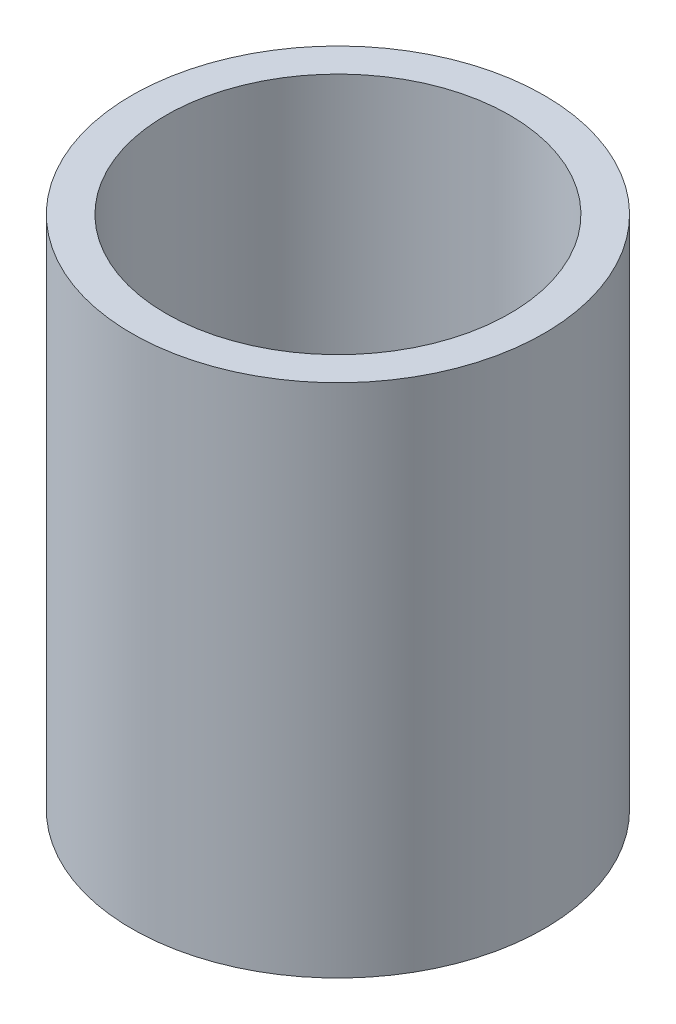
ISO-10303-21;
HEADER;
FILE_DESCRIPTION(('STEP AP214'),'2;1');
FILE_NAME('part.step','',(''),(''),'','','');
FILE_SCHEMA(('AUTOMOTIVE_DESIGN { 1 0 10303 214 1 1 1 1 }'));
ENDSEC;
DATA;
#1=APPLICATION_CONTEXT('core data for automotive mechanical design processes');
#2=APPLICATION_PROTOCOL_DEFINITION('international standard','automotive_design',2000,#1);
#3=PRODUCT_CONTEXT('',#1,'mechanical');
#4=PRODUCT('Part','Part','',(#3));
#5=PRODUCT_RELATED_PRODUCT_CATEGORY('part','',(#4));
#6=PRODUCT_DEFINITION_FORMATION('','',#4);
#7=PRODUCT_DEFINITION_CONTEXT('part definition',#1,'design');
#8=PRODUCT_DEFINITION('design','',#6,#7);
#9=PRODUCT_DEFINITION_SHAPE('','',#8);
#10=(LENGTH_UNIT() NAMED_UNIT(*) SI_UNIT(.MILLI.,.METRE.));
#11=(NAMED_UNIT(*) PLANE_ANGLE_UNIT() SI_UNIT($,.RADIAN.));
#12=(NAMED_UNIT(*) SI_UNIT($,.STERADIAN.) SOLID_ANGLE_UNIT());
#13=UNCERTAINTY_MEASURE_WITH_UNIT(LENGTH_MEASURE(1.E-05),#10,'distance_accuracy_value','');
#14=(GEOMETRIC_REPRESENTATION_CONTEXT(3) GLOBAL_UNCERTAINTY_ASSIGNED_CONTEXT((#13)) GLOBAL_UNIT_ASSIGNED_CONTEXT((#10,
#11,#12)) REPRESENTATION_CONTEXT('',''));
#15=CARTESIAN_POINT('',(0.,0.,0.));
#16=DIRECTION('',(0.,0.,1.));
#17=DIRECTION('',(1.,0.,0.));
#18=AXIS2_PLACEMENT_3D('',#15,#16,#17);
#19=CARTESIAN_POINT('',(0.,45.,-0.545038043279879));
#20=DIRECTION('',(0.,1.,0.));
#21=DIRECTION('',(0.,0.,1.));
#22=AXIS2_PLACEMENT_3D('',#19,#20,#21);
#23=PLANE('',#22);
#24=CARTESIAN_POINT('',(0.,45.,-0.545038043279879));
#25=DIRECTION('',(0.,1.,0.));
#26=DIRECTION('',(0.,0.,1.));
#27=AXIS2_PLACEMENT_3D('',#24,#25,#26);
#28=CIRCLE('',#27,18.);
#29=CARTESIAN_POINT('',(0.,45.,-18.5450380432799));
#30=VERTEX_POINT('',#29);
#31=EDGE_CURVE('E10',#30,#30,#28,.T.);
#32=ORIENTED_EDGE('',*,*,#31,.T.);
#33=EDGE_LOOP('',(#32));
#34=FACE_BOUND('',#33,.T.);
#35=CARTESIAN_POINT('',(0.,45.,-0.545038043279879));
#36=DIRECTION('',(0.,1.,0.));
#37=DIRECTION('',(0.,0.,1.));
#38=AXIS2_PLACEMENT_3D('',#35,#36,#37);
#39=CIRCLE('',#38,15.);
#40=CARTESIAN_POINT('',(0.,45.,-15.5450380432799));
#41=VERTEX_POINT('',#40);
#42=EDGE_CURVE('E52',#41,#41,#39,.T.);
#43=ORIENTED_EDGE('',*,*,#42,.F.);
#44=EDGE_LOOP('',(#43));
#45=FACE_BOUND('',#44,.T.);
#46=ADVANCED_FACE('F39',(#34,#45),#23,.T.);
#47=CARTESIAN_POINT('',(0.,0.,-0.545038043279879));
#48=DIRECTION('',(0.,1.,0.));
#49=DIRECTION('',(0.,0.,1.));
#50=AXIS2_PLACEMENT_3D('',#47,#48,#49);
#51=PLANE('',#50);
#52=CARTESIAN_POINT('',(0.,0.,-0.545038043279879));
#53=DIRECTION('',(0.,1.,0.));
#54=DIRECTION('',(0.,0.,1.));
#55=AXIS2_PLACEMENT_3D('',#52,#53,#54);
#56=CIRCLE('',#55,18.);
#57=CARTESIAN_POINT('',(0.,0.,-18.5450380432799));
#58=VERTEX_POINT('',#57);
#59=EDGE_CURVE('E43',#58,#58,#56,.T.);
#60=ORIENTED_EDGE('',*,*,#59,.F.);
#61=EDGE_LOOP('',(#60));
#62=FACE_BOUND('',#61,.T.);
#63=CARTESIAN_POINT('',(0.,0.,-0.545038043279879));
#64=DIRECTION('',(0.,1.,0.));
#65=DIRECTION('',(0.,0.,1.));
#66=AXIS2_PLACEMENT_3D('',#63,#64,#65);
#67=CIRCLE('',#66,15.);
#68=CARTESIAN_POINT('',(0.,0.,-15.5450380432799));
#69=VERTEX_POINT('',#68);
#70=EDGE_CURVE('E54',#69,#69,#67,.T.);
#71=ORIENTED_EDGE('',*,*,#70,.T.);
#72=EDGE_LOOP('',(#71));
#73=FACE_BOUND('',#72,.T.);
#74=ADVANCED_FACE('F66',(#62,#73),#51,.F.);
#75=CARTESIAN_POINT('',(0.,45.,-0.545038043279879));
#76=DIRECTION('',(0.,-1.,0.));
#77=DIRECTION('',(0.,0.,-1.));
#78=AXIS2_PLACEMENT_3D('',#75,#76,#77);
#79=CYLINDRICAL_SURFACE('',#78,18.);
#80=CARTESIAN_POINT('',(0.,45.,-18.5450380432799));
#81=CARTESIAN_POINT('',(0.,44.53125,-18.5450380432799));
#82=CARTESIAN_POINT('',(0.,44.0625,-18.5450380432799));
#83=CARTESIAN_POINT('',(0.,43.125,-18.5450380432799));
#84=CARTESIAN_POINT('',(0.,42.65625,-18.5450380432799));
#85=CARTESIAN_POINT('',(0.,41.71875,-18.5450380432799));
#86=CARTESIAN_POINT('',(0.,41.25,-18.5450380432799));
#87=CARTESIAN_POINT('',(0.,40.3125,-18.5450380432799));
#88=CARTESIAN_POINT('',(0.,39.84375,-18.5450380432799));
#89=CARTESIAN_POINT('',(0.,38.90625,-18.5450380432799));
#90=CARTESIAN_POINT('',(0.,38.4375,-18.5450380432799));
#91=CARTESIAN_POINT('',(0.,37.5,-18.5450380432799));
#92=CARTESIAN_POINT('',(0.,37.03125,-18.5450380432799));
#93=CARTESIAN_POINT('',(0.,36.09375,-18.5450380432799));
#94=CARTESIAN_POINT('',(0.,35.625,-18.5450380432799));
#95=CARTESIAN_POINT('',(0.,34.6875,-18.5450380432799));
#96=CARTESIAN_POINT('',(0.,34.21875,-18.5450380432799));
#97=CARTESIAN_POINT('',(0.,33.28125,-18.5450380432799));
#98=CARTESIAN_POINT('',(0.,32.8125,-18.5450380432799));
#99=CARTESIAN_POINT('',(0.,31.875,-18.5450380432799));
#100=CARTESIAN_POINT('',(0.,31.40625,-18.5450380432799));
#101=CARTESIAN_POINT('',(0.,30.46875,-18.5450380432799));
#102=CARTESIAN_POINT('',(0.,30.,-18.5450380432799));
#103=CARTESIAN_POINT('',(0.,29.0625,-18.5450380432799));
#104=CARTESIAN_POINT('',(0.,28.59375,-18.5450380432799));
#105=CARTESIAN_POINT('',(0.,27.65625,-18.5450380432799));
#106=CARTESIAN_POINT('',(0.,27.1875,-18.5450380432799));
#107=CARTESIAN_POINT('',(0.,26.25,-18.5450380432799));
#108=CARTESIAN_POINT('',(0.,25.78125,-18.5450380432799));
#109=CARTESIAN_POINT('',(0.,24.84375,-18.5450380432799));
#110=CARTESIAN_POINT('',(0.,24.375,-18.5450380432799));
#111=CARTESIAN_POINT('',(0.,23.4375,-18.5450380432799));
#112=CARTESIAN_POINT('',(0.,22.96875,-18.5450380432799));
#113=CARTESIAN_POINT('',(0.,22.03125,-18.5450380432799));
#114=CARTESIAN_POINT('',(0.,21.5625,-18.5450380432799));
#115=CARTESIAN_POINT('',(0.,20.625,-18.5450380432799));
#116=CARTESIAN_POINT('',(0.,20.15625,-18.5450380432799));
#117=CARTESIAN_POINT('',(0.,19.21875,-18.5450380432799));
#118=CARTESIAN_POINT('',(0.,18.75,-18.5450380432799));
#119=CARTESIAN_POINT('',(0.,17.8125,-18.5450380432799));
#120=CARTESIAN_POINT('',(0.,17.34375,-18.5450380432799));
#121=CARTESIAN_POINT('',(0.,16.40625,-18.5450380432799));
#122=CARTESIAN_POINT('',(0.,15.9375,-18.5450380432799));
#123=CARTESIAN_POINT('',(0.,15.,-18.5450380432799));
#124=CARTESIAN_POINT('',(0.,14.53125,-18.5450380432799));
#125=CARTESIAN_POINT('',(0.,13.59375,-18.5450380432799));
#126=CARTESIAN_POINT('',(0.,13.125,-18.5450380432799));
#127=CARTESIAN_POINT('',(0.,12.1875,-18.5450380432799));
#128=CARTESIAN_POINT('',(0.,11.71875,-18.5450380432799));
#129=CARTESIAN_POINT('',(0.,10.78125,-18.5450380432799));
#130=CARTESIAN_POINT('',(0.,10.3125,-18.5450380432799));
#131=CARTESIAN_POINT('',(0.,9.375,-18.5450380432799));
#132=CARTESIAN_POINT('',(0.,8.90625,-18.5450380432799));
#133=CARTESIAN_POINT('',(0.,7.96874999999999,-18.5450380432799));
#134=CARTESIAN_POINT('',(0.,7.5,-18.5450380432799));
#135=CARTESIAN_POINT('',(0.,6.5625,-18.5450380432799));
#136=CARTESIAN_POINT('',(0.,6.09375,-18.5450380432799));
#137=CARTESIAN_POINT('',(0.,5.15625,-18.5450380432799));
#138=CARTESIAN_POINT('',(0.,4.68749999999999,-18.5450380432799));
#139=CARTESIAN_POINT('',(0.,3.74999999999999,-18.5450380432799));
#140=CARTESIAN_POINT('',(0.,3.28124999999999,-18.5450380432799));
#141=CARTESIAN_POINT('',(0.,2.34374999999999,-18.5450380432799));
#142=CARTESIAN_POINT('',(0.,1.87499999999999,-18.5450380432799));
#143=CARTESIAN_POINT('',(0.,0.937499999999992,-18.5450380432799));
#144=CARTESIAN_POINT('',(0.,0.468749999999993,-18.5450380432799));
#145=CARTESIAN_POINT('',(0.,0.,-18.5450380432799));
#146=B_SPLINE_CURVE_WITH_KNOTS('',3,(#80,#81,#82,#83,#84,#85,#86,#87,#88,#89,#90,#91,#92,#93,
#94,#95,#96,#97,#98,#99,#100,#101,#102,#103,#104,#105,#106,#107,#108,#109,#110,#111,#112,#113,
#114,#115,#116,#117,#118,#119,#120,#121,#122,#123,#124,#125,#126,#127,#128,#129,#130,#131,#132,
#133,#134,#135,#136,#137,#138,#139,#140,#141,#142,#143,#144,#145),.UNSPECIFIED.,.F.,.F.,(4,2,2,
2,2,2,2,2,2,2,2,2,2,2,2,2,2,2,2,2,2,2,2,2,2,2,2,2,2,2,2,2,4),(0.,1.40625,2.8125,
4.21875000000001,5.62500000000001,7.03125,8.4375,9.84375000000001,11.25,12.65625,14.0625,
15.46875,16.875,18.28125,19.6875,21.09375,22.5,23.90625,25.3125,26.71875,28.125,29.53125,
30.9375,32.34375,33.75,35.15625,36.5625,37.96875,39.375,40.78125,42.1875,43.59375,45.),.UNSPECIFIED.);
#147=EDGE_CURVE('BSEAM41',#30,#58,#146,.T.);
#148=ORIENTED_EDGE('',*,*,#31,.F.);
#149=ORIENTED_EDGE('',*,*,#59,.T.);
#150=ORIENTED_EDGE('',*,*,#147,.T.);
#151=ORIENTED_EDGE('',*,*,#147,.F.);
#152=EDGE_LOOP('',(#148,#150,#149,#151));
#153=FACE_BOUND('',#152,.T.);
#154=ADVANCED_FACE('F41',(#153),#79,.T.);
#155=CARTESIAN_POINT('',(0.,45.,-0.545038043279879));
#156=DIRECTION('',(0.,-1.,0.));
#157=DIRECTION('',(0.,0.,-1.));
#158=AXIS2_PLACEMENT_3D('',#155,#156,#157);
#159=CYLINDRICAL_SURFACE('',#158,15.);
#160=CARTESIAN_POINT('',(0.,45.,-15.5450380432799));
#161=CARTESIAN_POINT('',(0.,44.53125,-15.5450380432799));
#162=CARTESIAN_POINT('',(0.,44.0625,-15.5450380432799));
#163=CARTESIAN_POINT('',(0.,43.125,-15.5450380432799));
#164=CARTESIAN_POINT('',(0.,42.65625,-15.5450380432799));
#165=CARTESIAN_POINT('',(0.,41.71875,-15.5450380432799));
#166=CARTESIAN_POINT('',(0.,41.25,-15.5450380432799));
#167=CARTESIAN_POINT('',(0.,40.3125,-15.5450380432799));
#168=CARTESIAN_POINT('',(0.,39.84375,-15.5450380432799));
#169=CARTESIAN_POINT('',(0.,38.90625,-15.5450380432799));
#170=CARTESIAN_POINT('',(0.,38.4375,-15.5450380432799));
#171=CARTESIAN_POINT('',(0.,37.5,-15.5450380432799));
#172=CARTESIAN_POINT('',(0.,37.03125,-15.5450380432799));
#173=CARTESIAN_POINT('',(0.,36.09375,-15.5450380432799));
#174=CARTESIAN_POINT('',(0.,35.625,-15.5450380432799));
#175=CARTESIAN_POINT('',(0.,34.6875,-15.5450380432799));
#176=CARTESIAN_POINT('',(0.,34.21875,-15.5450380432799));
#177=CARTESIAN_POINT('',(0.,33.28125,-15.5450380432799));
#178=CARTESIAN_POINT('',(0.,32.8125,-15.5450380432799));
#179=CARTESIAN_POINT('',(0.,31.875,-15.5450380432799));
#180=CARTESIAN_POINT('',(0.,31.40625,-15.5450380432799));
#181=CARTESIAN_POINT('',(0.,30.46875,-15.5450380432799));
#182=CARTESIAN_POINT('',(0.,30.,-15.5450380432799));
#183=CARTESIAN_POINT('',(0.,29.0625,-15.5450380432799));
#184=CARTESIAN_POINT('',(0.,28.59375,-15.5450380432799));
#185=CARTESIAN_POINT('',(0.,27.65625,-15.5450380432799));
#186=CARTESIAN_POINT('',(0.,27.1875,-15.5450380432799));
#187=CARTESIAN_POINT('',(0.,26.25,-15.5450380432799));
#188=CARTESIAN_POINT('',(0.,25.78125,-15.5450380432799));
#189=CARTESIAN_POINT('',(0.,24.84375,-15.5450380432799));
#190=CARTESIAN_POINT('',(0.,24.375,-15.5450380432799));
#191=CARTESIAN_POINT('',(0.,23.4375,-15.5450380432799));
#192=CARTESIAN_POINT('',(0.,22.96875,-15.5450380432799));
#193=CARTESIAN_POINT('',(0.,22.03125,-15.5450380432799));
#194=CARTESIAN_POINT('',(0.,21.5625,-15.5450380432799));
#195=CARTESIAN_POINT('',(0.,20.625,-15.5450380432799));
#196=CARTESIAN_POINT('',(0.,20.15625,-15.5450380432799));
#197=CARTESIAN_POINT('',(0.,19.21875,-15.5450380432799));
#198=CARTESIAN_POINT('',(0.,18.75,-15.5450380432799));
#199=CARTESIAN_POINT('',(0.,17.8125,-15.5450380432799));
#200=CARTESIAN_POINT('',(0.,17.34375,-15.5450380432799));
#201=CARTESIAN_POINT('',(0.,16.40625,-15.5450380432799));
#202=CARTESIAN_POINT('',(0.,15.9375,-15.5450380432799));
#203=CARTESIAN_POINT('',(0.,15.,-15.5450380432799));
#204=CARTESIAN_POINT('',(0.,14.53125,-15.5450380432799));
#205=CARTESIAN_POINT('',(0.,13.59375,-15.5450380432799));
#206=CARTESIAN_POINT('',(0.,13.125,-15.5450380432799));
#207=CARTESIAN_POINT('',(0.,12.1875,-15.5450380432799));
#208=CARTESIAN_POINT('',(0.,11.71875,-15.5450380432799));
#209=CARTESIAN_POINT('',(0.,10.78125,-15.5450380432799));
#210=CARTESIAN_POINT('',(0.,10.3125,-15.5450380432799));
#211=CARTESIAN_POINT('',(0.,9.37499999999999,-15.5450380432799));
#212=CARTESIAN_POINT('',(0.,8.90624999999999,-15.5450380432799));
#213=CARTESIAN_POINT('',(0.,7.96874999999999,-15.5450380432799));
#214=CARTESIAN_POINT('',(0.,7.5,-15.5450380432799));
#215=CARTESIAN_POINT('',(0.,6.56249999999999,-15.5450380432799));
#216=CARTESIAN_POINT('',(0.,6.09374999999999,-15.5450380432799));
#217=CARTESIAN_POINT('',(0.,5.15624999999999,-15.5450380432799));
#218=CARTESIAN_POINT('',(0.,4.68749999999999,-15.5450380432799));
#219=CARTESIAN_POINT('',(0.,3.74999999999999,-15.5450380432799));
#220=CARTESIAN_POINT('',(0.,3.28124999999999,-15.5450380432799));
#221=CARTESIAN_POINT('',(0.,2.34374999999999,-15.5450380432799));
#222=CARTESIAN_POINT('',(0.,1.87499999999999,-15.5450380432799));
#223=CARTESIAN_POINT('',(0.,0.937499999999992,-15.5450380432799));
#224=CARTESIAN_POINT('',(0.,0.468749999999993,-15.5450380432799));
#225=CARTESIAN_POINT('',(0.,0.,-15.5450380432799));
#226=B_SPLINE_CURVE_WITH_KNOTS('',3,(#160,#161,#162,#163,#164,#165,#166,#167,#168,#169,#170,
#171,#172,#173,#174,#175,#176,#177,#178,#179,#180,#181,#182,#183,#184,#185,#186,#187,#188,#189,
#190,#191,#192,#193,#194,#195,#196,#197,#198,#199,#200,#201,#202,#203,#204,#205,#206,#207,#208,
#209,#210,#211,#212,#213,#214,#215,#216,#217,#218,#219,#220,#221,#222,#223,#224,#225),
.UNSPECIFIED.,.F.,.F.,(4,2,2,2,2,2,2,2,2,2,2,2,2,2,2,2,2,2,2,2,2,2,2,2,2,2,2,2,2,2,2,2,4),(0.,
1.40625,2.8125,4.21874999999999,5.625,7.03125,8.43749999999999,9.84375,11.25,12.65625,14.0625,
15.46875,16.875,18.28125,19.6875,21.09375,22.5,23.90625,25.3125,26.71875,28.125,29.53125,
30.9375,32.34375,33.75,35.15625,36.5625,37.96875,39.375,40.78125,42.1875,43.59375,45.),.UNSPECIFIED.);
#227=EDGE_CURVE('BSEAM62',#41,#69,#226,.T.);
#228=ORIENTED_EDGE('',*,*,#42,.T.);
#229=ORIENTED_EDGE('',*,*,#70,.F.);
#230=ORIENTED_EDGE('',*,*,#227,.T.);
#231=ORIENTED_EDGE('',*,*,#227,.F.);
#232=EDGE_LOOP('',(#228,#230,#229,#231));
#233=FACE_BOUND('',#232,.T.);
#234=ADVANCED_FACE('F62',(#233),#159,.F.);
#235=CLOSED_SHELL('',(#46,#74,#154,#234));
#236=MANIFOLD_SOLID_BREP('B2',#235);
#237=ADVANCED_BREP_SHAPE_REPRESENTATION('',(#18,#236),#14);
#238=SHAPE_DEFINITION_REPRESENTATION(#9,#237);
ENDSEC;
END-ISO-10303-21;
